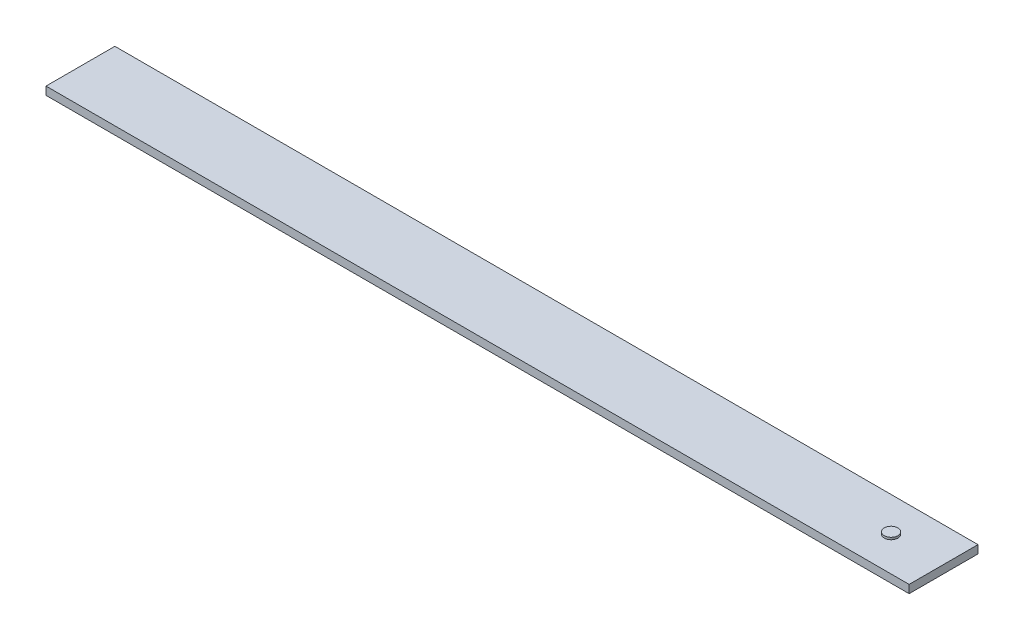
ISO-10303-21;
HEADER;
FILE_DESCRIPTION(('STEP AP214'),'2;1');
FILE_NAME('part.step','',(''),(''),'','','');
FILE_SCHEMA(('AUTOMOTIVE_DESIGN { 1 0 10303 214 1 1 1 1 }'));
ENDSEC;
DATA;
#1=APPLICATION_CONTEXT('core data for automotive mechanical design processes');
#2=APPLICATION_PROTOCOL_DEFINITION('international standard','automotive_design',2000,#1);
#3=PRODUCT_CONTEXT('',#1,'mechanical');
#4=PRODUCT('Part','Part','',(#3));
#5=PRODUCT_RELATED_PRODUCT_CATEGORY('part','',(#4));
#6=PRODUCT_DEFINITION_FORMATION('','',#4);
#7=PRODUCT_DEFINITION_CONTEXT('part definition',#1,'design');
#8=PRODUCT_DEFINITION('design','',#6,#7);
#9=PRODUCT_DEFINITION_SHAPE('','',#8);
#10=(LENGTH_UNIT() NAMED_UNIT(*) SI_UNIT(.MILLI.,.METRE.));
#11=(NAMED_UNIT(*) PLANE_ANGLE_UNIT() SI_UNIT($,.RADIAN.));
#12=(NAMED_UNIT(*) SI_UNIT($,.STERADIAN.) SOLID_ANGLE_UNIT());
#13=UNCERTAINTY_MEASURE_WITH_UNIT(LENGTH_MEASURE(1.E-05),#10,'distance_accuracy_value','');
#14=(GEOMETRIC_REPRESENTATION_CONTEXT(3) GLOBAL_UNCERTAINTY_ASSIGNED_CONTEXT((#13)) GLOBAL_UNIT_ASSIGNED_CONTEXT((#10,
#11,#12)) REPRESENTATION_CONTEXT('',''));
#15=CARTESIAN_POINT('',(0.,0.,0.));
#16=DIRECTION('',(0.,0.,1.));
#17=DIRECTION('',(1.,0.,0.));
#18=AXIS2_PLACEMENT_3D('',#15,#16,#17);
#19=CARTESIAN_POINT('',(0.,3.75,0.));
#20=DIRECTION('',(0.,-1.,0.));
#21=DIRECTION('',(0.,0.,-1.));
#22=AXIS2_PLACEMENT_3D('',#19,#20,#21);
#23=PLANE('',#22);
#24=DIRECTION('',(0.,0.,1.));
#25=VECTOR('',#24,1.);
#26=CARTESIAN_POINT('',(0.,3.75,0.));
#27=LINE('',#26,#25);
#28=CARTESIAN_POINT('',(0.,3.75,-32.));
#29=VERTEX_POINT('',#28);
#30=CARTESIAN_POINT('',(0.,3.75,0.));
#31=VERTEX_POINT('',#30);
#32=EDGE_CURVE('E96',#29,#31,#27,.T.);
#33=ORIENTED_EDGE('',*,*,#32,.T.);
#34=DIRECTION('',(1.,0.,0.));
#35=VECTOR('',#34,1.);
#36=CARTESIAN_POINT('',(0.,3.75,0.));
#37=LINE('',#36,#35);
#38=CARTESIAN_POINT('',(401.,3.75,0.));
#39=VERTEX_POINT('',#38);
#40=EDGE_CURVE('E91',#31,#39,#37,.T.);
#41=ORIENTED_EDGE('',*,*,#40,.T.);
#42=DIRECTION('',(0.,0.,-1.));
#43=VECTOR('',#42,1.);
#44=CARTESIAN_POINT('',(401.,3.75,0.));
#45=LINE('',#44,#43);
#46=CARTESIAN_POINT('',(401.,3.75,-32.));
#47=VERTEX_POINT('',#46);
#48=EDGE_CURVE('E94',#39,#47,#45,.T.);
#49=ORIENTED_EDGE('',*,*,#48,.T.);
#50=DIRECTION('',(-1.,0.,0.));
#51=VECTOR('',#50,1.);
#52=CARTESIAN_POINT('',(0.,3.75,-32.));
#53=LINE('',#52,#51);
#54=EDGE_CURVE('E60',#47,#29,#53,.T.);
#55=ORIENTED_EDGE('',*,*,#54,.T.);
#56=EDGE_LOOP('',(#33,#41,#49,#55));
#57=FACE_BOUND('',#56,.T.);
#58=CARTESIAN_POINT('',(376.65,3.75,-16.));
#59=DIRECTION('',(0.,-1.,0.));
#60=DIRECTION('',(0.,0.,-1.));
#61=AXIS2_PLACEMENT_3D('',#58,#59,#60);
#62=CIRCLE('',#61,3.15000000000001);
#63=CARTESIAN_POINT('',(376.65,3.75,-19.15));
#64=VERTEX_POINT('',#63);
#65=EDGE_CURVE('E11',#64,#64,#62,.F.);
#66=ORIENTED_EDGE('',*,*,#65,.F.);
#67=EDGE_LOOP('',(#66));
#68=FACE_BOUND('',#67,.T.);
#69=ADVANCED_FACE('F43',(#57,#68),#23,.F.);
#70=CARTESIAN_POINT('',(0.,3.75,0.));
#71=DIRECTION('',(1.,0.,0.));
#72=DIRECTION('',(0.,0.,-1.));
#73=AXIS2_PLACEMENT_3D('',#70,#71,#72);
#74=PLANE('',#73);
#75=DIRECTION('',(0.,0.,1.));
#76=VECTOR('',#75,1.);
#77=CARTESIAN_POINT('',(0.,0.,0.));
#78=LINE('',#77,#76);
#79=CARTESIAN_POINT('',(0.,0.,-32.));
#80=VERTEX_POINT('',#79);
#81=CARTESIAN_POINT('',(0.,0.,0.));
#82=VERTEX_POINT('',#81);
#83=EDGE_CURVE('E110',#80,#82,#78,.T.);
#84=ORIENTED_EDGE('',*,*,#83,.T.);
#85=DIRECTION('',(0.,-1.,0.));
#86=VECTOR('',#85,1.);
#87=CARTESIAN_POINT('',(0.,3.75,0.));
#88=LINE('',#87,#86);
#89=EDGE_CURVE('E52',#31,#82,#88,.T.);
#90=ORIENTED_EDGE('',*,*,#89,.F.);
#91=ORIENTED_EDGE('',*,*,#32,.F.);
#92=DIRECTION('',(0.,-1.,0.));
#93=VECTOR('',#92,1.);
#94=CARTESIAN_POINT('',(0.,3.75,-32.));
#95=LINE('',#94,#93);
#96=EDGE_CURVE('E106',#29,#80,#95,.T.);
#97=ORIENTED_EDGE('',*,*,#96,.T.);
#98=EDGE_LOOP('',(#84,#90,#91,#97));
#99=FACE_BOUND('',#98,.T.);
#100=ADVANCED_FACE('F45',(#99),#74,.F.);
#101=CARTESIAN_POINT('',(0.,3.75,0.));
#102=DIRECTION('',(0.,0.,-1.));
#103=DIRECTION('',(-1.,0.,0.));
#104=AXIS2_PLACEMENT_3D('',#101,#102,#103);
#105=PLANE('',#104);
#106=DIRECTION('',(1.,0.,0.));
#107=VECTOR('',#106,1.);
#108=CARTESIAN_POINT('',(0.,0.,0.));
#109=LINE('',#108,#107);
#110=CARTESIAN_POINT('',(401.,0.,0.));
#111=VERTEX_POINT('',#110);
#112=EDGE_CURVE('E101',#82,#111,#109,.T.);
#113=ORIENTED_EDGE('',*,*,#112,.T.);
#114=DIRECTION('',(0.,-1.,0.));
#115=VECTOR('',#114,1.);
#116=CARTESIAN_POINT('',(401.,3.75,0.));
#117=LINE('',#116,#115);
#118=EDGE_CURVE('E99',#39,#111,#117,.T.);
#119=ORIENTED_EDGE('',*,*,#118,.F.);
#120=ORIENTED_EDGE('',*,*,#40,.F.);
#121=ORIENTED_EDGE('',*,*,#89,.T.);
#122=EDGE_LOOP('',(#113,#119,#120,#121));
#123=FACE_BOUND('',#122,.T.);
#124=ADVANCED_FACE('F100',(#123),#105,.F.);
#125=CARTESIAN_POINT('',(401.,3.75,0.));
#126=DIRECTION('',(-1.,0.,0.));
#127=DIRECTION('',(0.,0.,1.));
#128=AXIS2_PLACEMENT_3D('',#125,#126,#127);
#129=PLANE('',#128);
#130=DIRECTION('',(0.,0.,-1.));
#131=VECTOR('',#130,1.);
#132=CARTESIAN_POINT('',(401.,0.,0.));
#133=LINE('',#132,#131);
#134=CARTESIAN_POINT('',(401.,0.,-32.));
#135=VERTEX_POINT('',#134);
#136=EDGE_CURVE('E77',#111,#135,#133,.T.);
#137=ORIENTED_EDGE('',*,*,#136,.T.);
#138=DIRECTION('',(0.,-1.,0.));
#139=VECTOR('',#138,1.);
#140=CARTESIAN_POINT('',(401.,3.75,-32.));
#141=LINE('',#140,#139);
#142=EDGE_CURVE('E102',#47,#135,#141,.T.);
#143=ORIENTED_EDGE('',*,*,#142,.F.);
#144=ORIENTED_EDGE('',*,*,#48,.F.);
#145=ORIENTED_EDGE('',*,*,#118,.T.);
#146=EDGE_LOOP('',(#137,#143,#144,#145));
#147=FACE_BOUND('',#146,.T.);
#148=ADVANCED_FACE('F104',(#147),#129,.F.);
#149=CARTESIAN_POINT('',(0.,3.75,-32.));
#150=DIRECTION('',(0.,0.,1.));
#151=DIRECTION('',(1.,0.,0.));
#152=AXIS2_PLACEMENT_3D('',#149,#150,#151);
#153=PLANE('',#152);
#154=DIRECTION('',(-1.,0.,0.));
#155=VECTOR('',#154,1.);
#156=CARTESIAN_POINT('',(0.,0.,-32.));
#157=LINE('',#156,#155);
#158=EDGE_CURVE('E83',#135,#80,#157,.T.);
#159=ORIENTED_EDGE('',*,*,#158,.T.);
#160=ORIENTED_EDGE('',*,*,#96,.F.);
#161=ORIENTED_EDGE('',*,*,#54,.F.);
#162=ORIENTED_EDGE('',*,*,#142,.T.);
#163=EDGE_LOOP('',(#159,#160,#161,#162));
#164=FACE_BOUND('',#163,.T.);
#165=ADVANCED_FACE('F124',(#164),#153,.F.);
#166=CARTESIAN_POINT('',(0.,0.,0.));
#167=DIRECTION('',(0.,-1.,0.));
#168=DIRECTION('',(0.,0.,-1.));
#169=AXIS2_PLACEMENT_3D('',#166,#167,#168);
#170=PLANE('',#169);
#171=ORIENTED_EDGE('',*,*,#83,.F.);
#172=ORIENTED_EDGE('',*,*,#158,.F.);
#173=ORIENTED_EDGE('',*,*,#136,.F.);
#174=ORIENTED_EDGE('',*,*,#112,.F.);
#175=EDGE_LOOP('',(#171,#172,#173,#174));
#176=FACE_BOUND('',#175,.T.);
#177=ADVANCED_FACE('F121',(#176),#170,.T.);
#178=CARTESIAN_POINT('',(376.65,4.75,-16.));
#179=DIRECTION('',(0.,-1.,0.));
#180=DIRECTION('',(0.,0.,-1.));
#181=AXIS2_PLACEMENT_3D('',#178,#179,#180);
#182=CYLINDRICAL_SURFACE('',#181,3.15000000000001);
#183=CARTESIAN_POINT('',(376.65,4.75,-16.));
#184=DIRECTION('',(0.,1.,0.));
#185=DIRECTION('',(0.,0.,1.));
#186=AXIS2_PLACEMENT_3D('',#183,#184,#185);
#187=CIRCLE('',#186,3.15000000000001);
#188=CARTESIAN_POINT('',(376.65,4.75,-12.85));
#189=VERTEX_POINT('',#188);
#190=EDGE_CURVE('E113',#189,#189,#187,.T.);
#191=ORIENTED_EDGE('',*,*,#190,.F.);
#192=EDGE_LOOP('',(#191));
#193=FACE_BOUND('',#192,.T.);
#194=ORIENTED_EDGE('',*,*,#65,.T.);
#195=EDGE_LOOP('',(#194));
#196=FACE_BOUND('',#195,.T.);
#197=ADVANCED_FACE('F123',(#193,#196),#182,.T.);
#198=CARTESIAN_POINT('',(376.65,4.75,-16.));
#199=DIRECTION('',(0.,1.,0.));
#200=DIRECTION('',(0.,0.,1.));
#201=AXIS2_PLACEMENT_3D('',#198,#199,#200);
#202=PLANE('',#201);
#203=ORIENTED_EDGE('',*,*,#190,.T.);
#204=EDGE_LOOP('',(#203));
#205=FACE_BOUND('',#204,.T.);
#206=ADVANCED_FACE('F130',(#205),#202,.T.);
#207=CLOSED_SHELL('',(#69,#100,#124,#148,#165,#177,#197,#206));
#208=MANIFOLD_SOLID_BREP('B2',#207);
#209=ADVANCED_BREP_SHAPE_REPRESENTATION('',(#18,#208),#14);
#210=SHAPE_DEFINITION_REPRESENTATION(#9,#209);
ENDSEC;
END-ISO-10303-21;
